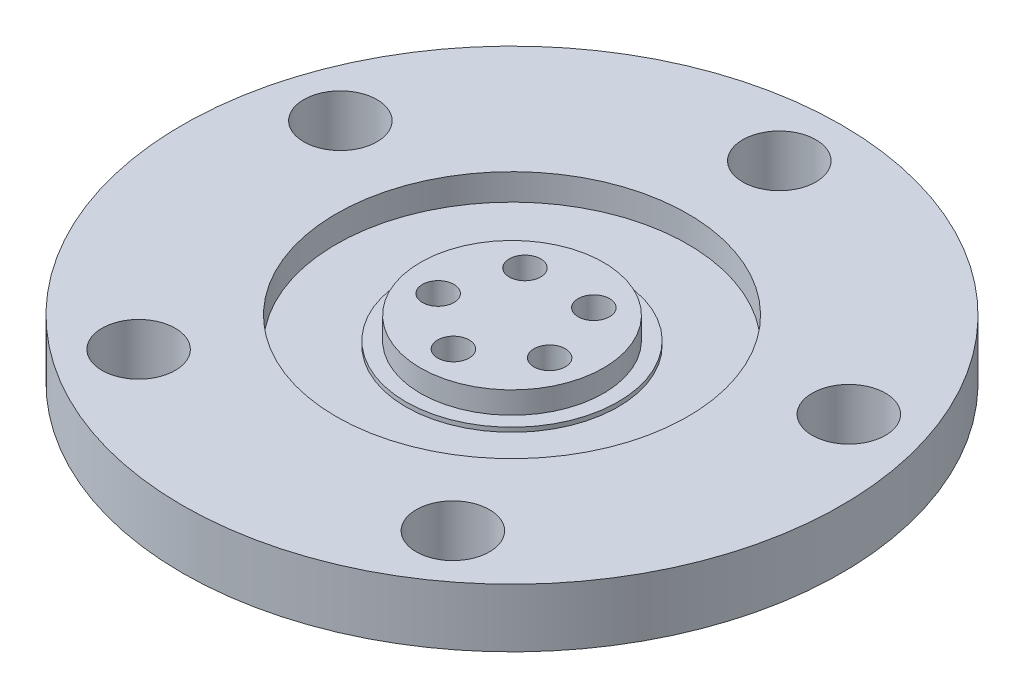
ISO-10303-21;
HEADER;
FILE_DESCRIPTION(('STEP AP214'),'2;1');
FILE_NAME('part.step','',(''),(''),'','','');
FILE_SCHEMA(('AUTOMOTIVE_DESIGN { 1 0 10303 214 1 1 1 1 }'));
ENDSEC;
DATA;
#1=APPLICATION_CONTEXT('core data for automotive mechanical design processes');
#2=APPLICATION_PROTOCOL_DEFINITION('international standard','automotive_design',2000,#1);
#3=PRODUCT_CONTEXT('',#1,'mechanical');
#4=PRODUCT('Part','Part','',(#3));
#5=PRODUCT_RELATED_PRODUCT_CATEGORY('part','',(#4));
#6=PRODUCT_DEFINITION_FORMATION('','',#4);
#7=PRODUCT_DEFINITION_CONTEXT('part definition',#1,'design');
#8=PRODUCT_DEFINITION('design','',#6,#7);
#9=PRODUCT_DEFINITION_SHAPE('','',#8);
#10=(LENGTH_UNIT() NAMED_UNIT(*) SI_UNIT(.MILLI.,.METRE.));
#11=(NAMED_UNIT(*) PLANE_ANGLE_UNIT() SI_UNIT($,.RADIAN.));
#12=(NAMED_UNIT(*) SI_UNIT($,.STERADIAN.) SOLID_ANGLE_UNIT());
#13=UNCERTAINTY_MEASURE_WITH_UNIT(LENGTH_MEASURE(1.E-05),#10,'distance_accuracy_value','');
#14=(GEOMETRIC_REPRESENTATION_CONTEXT(3) GLOBAL_UNCERTAINTY_ASSIGNED_CONTEXT((#13)) GLOBAL_UNIT_ASSIGNED_CONTEXT((#10,
#11,#12)) REPRESENTATION_CONTEXT('',''));
#15=CARTESIAN_POINT('',(0.,0.,0.));
#16=DIRECTION('',(0.,0.,1.));
#17=DIRECTION('',(1.,0.,0.));
#18=AXIS2_PLACEMENT_3D('',#15,#16,#17);
#19=CARTESIAN_POINT('',(0.,5.,0.));
#20=DIRECTION('',(0.,1.,0.));
#21=DIRECTION('',(0.,0.,1.));
#22=AXIS2_PLACEMENT_3D('',#19,#20,#21);
#23=PLANE('',#22);
#24=CARTESIAN_POINT('',(0.,5.,0.));
#25=DIRECTION('',(0.,1.,0.));
#26=DIRECTION('',(0.,0.,1.));
#27=AXIS2_PLACEMENT_3D('',#24,#25,#26);
#28=CIRCLE('',#27,12.5);
#29=CARTESIAN_POINT('',(0.,5.,12.5));
#30=VERTEX_POINT('',#29);
#31=EDGE_CURVE('E118',#30,#30,#28,.T.);
#32=ORIENTED_EDGE('',*,*,#31,.F.);
#33=EDGE_LOOP('',(#32));
#34=FACE_BOUND('',#33,.T.);
#35=CARTESIAN_POINT('',(0.,5.,0.));
#36=DIRECTION('',(0.,1.,0.));
#37=DIRECTION('',(0.,0.,1.));
#38=AXIS2_PLACEMENT_3D('',#35,#36,#37);
#39=CIRCLE('',#38,14.5);
#40=CARTESIAN_POINT('',(0.,5.,14.5));
#41=VERTEX_POINT('',#40);
#42=EDGE_CURVE('E128',#41,#41,#39,.T.);
#43=ORIENTED_EDGE('',*,*,#42,.T.);
#44=EDGE_LOOP('',(#43));
#45=FACE_BOUND('',#44,.T.);
#46=ADVANCED_FACE('F31',(#34,#45),#23,.T.);
#47=CARTESIAN_POINT('',(0.,8.,0.));
#48=DIRECTION('',(0.,1.,0.));
#49=DIRECTION('',(0.,0.,1.));
#50=AXIS2_PLACEMENT_3D('',#47,#48,#49);
#51=PLANE('',#50);
#52=CARTESIAN_POINT('',(-7.60845213036006,8.,2.47213595500001));
#53=DIRECTION('',(0.,1.,0.));
#54=DIRECTION('',(0.,0.,1.));
#55=AXIS2_PLACEMENT_3D('',#52,#53,#54);
#56=CIRCLE('',#55,2.15);
#57=CARTESIAN_POINT('',(-7.60845213036006,8.,4.62213595500001));
#58=VERTEX_POINT('',#57);
#59=EDGE_CURVE('E76',#58,#58,#56,.T.);
#60=ORIENTED_EDGE('',*,*,#59,.F.);
#61=EDGE_LOOP('',(#60));
#62=FACE_BOUND('',#61,.T.);
#63=CARTESIAN_POINT('',(1.92137482375957E-12,8.,7.9999999999994));
#64=DIRECTION('',(0.,1.,0.));
#65=DIRECTION('',(0.,0.,1.));
#66=AXIS2_PLACEMENT_3D('',#63,#64,#65);
#67=CIRCLE('',#66,2.15);
#68=CARTESIAN_POINT('',(1.92137482375957E-12,8.,10.1499999999994));
#69=VERTEX_POINT('',#68);
#70=EDGE_CURVE('E82',#69,#69,#67,.T.);
#71=ORIENTED_EDGE('',*,*,#70,.F.);
#72=EDGE_LOOP('',(#71));
#73=FACE_BOUND('',#72,.T.);
#74=CARTESIAN_POINT('',(7.60845213036239,8.,2.47213595499794));
#75=DIRECTION('',(0.,1.,0.));
#76=DIRECTION('',(0.,0.,1.));
#77=AXIS2_PLACEMENT_3D('',#74,#75,#76);
#78=CIRCLE('',#77,2.15);
#79=CARTESIAN_POINT('',(7.60845213036239,8.,4.62213595499793));
#80=VERTEX_POINT('',#79);
#81=EDGE_CURVE('E88',#80,#80,#78,.T.);
#82=ORIENTED_EDGE('',*,*,#81,.F.);
#83=EDGE_LOOP('',(#82));
#84=FACE_BOUND('',#83,.T.);
#85=CARTESIAN_POINT('',(4.70228201833973,8.,-6.47213595500082));
#86=DIRECTION('',(0.,1.,0.));
#87=DIRECTION('',(0.,0.,1.));
#88=AXIS2_PLACEMENT_3D('',#85,#86,#87);
#89=CIRCLE('',#88,2.15);
#90=CARTESIAN_POINT('',(4.70228201833973,8.,-4.32213595500083));
#91=VERTEX_POINT('',#90);
#92=EDGE_CURVE('E94',#91,#91,#89,.T.);
#93=ORIENTED_EDGE('',*,*,#92,.F.);
#94=EDGE_LOOP('',(#93));
#95=FACE_BOUND('',#94,.T.);
#96=CARTESIAN_POINT('',(-4.70228201833984,8.,-6.47213595499954));
#97=DIRECTION('',(0.,1.,0.));
#98=DIRECTION('',(0.,0.,1.));
#99=AXIS2_PLACEMENT_3D('',#96,#97,#98);
#100=CIRCLE('',#99,2.15);
#101=CARTESIAN_POINT('',(-4.70228201833984,8.,-4.32213595499954));
#102=VERTEX_POINT('',#101);
#103=EDGE_CURVE('E100',#102,#102,#100,.T.);
#104=ORIENTED_EDGE('',*,*,#103,.F.);
#105=EDGE_LOOP('',(#104));
#106=FACE_BOUND('',#105,.T.);
#107=CARTESIAN_POINT('',(0.,8.,0.));
#108=DIRECTION('',(0.,1.,0.));
#109=DIRECTION('',(0.,0.,1.));
#110=AXIS2_PLACEMENT_3D('',#107,#108,#109);
#111=CIRCLE('',#110,12.5);
#112=CARTESIAN_POINT('',(0.,8.,12.5));
#113=VERTEX_POINT('',#112);
#114=EDGE_CURVE('E119',#113,#113,#111,.T.);
#115=ORIENTED_EDGE('',*,*,#114,.T.);
#116=EDGE_LOOP('',(#115));
#117=FACE_BOUND('',#116,.T.);
#118=ADVANCED_FACE('F160',(#62,#73,#84,#95,#106,#117),#51,.T.);
#119=CARTESIAN_POINT('',(0.,0.,0.));
#120=DIRECTION('',(0.,1.,0.));
#121=DIRECTION('',(0.,0.,1.));
#122=AXIS2_PLACEMENT_3D('',#119,#120,#121);
#123=PLANE('',#122);
#124=CARTESIAN_POINT('',(-7.60845213036006,0.,2.47213595500001));
#125=DIRECTION('',(0.,1.,0.));
#126=DIRECTION('',(0.,0.,1.));
#127=AXIS2_PLACEMENT_3D('',#124,#125,#126);
#128=CIRCLE('',#127,2.15);
#129=CARTESIAN_POINT('',(-7.60845213036006,0.,4.62213595500001));
#130=VERTEX_POINT('',#129);
#131=EDGE_CURVE('E71',#130,#130,#128,.T.);
#132=ORIENTED_EDGE('',*,*,#131,.T.);
#133=EDGE_LOOP('',(#132));
#134=FACE_BOUND('',#133,.T.);
#135=CARTESIAN_POINT('',(1.92137482375957E-12,0.,7.9999999999994));
#136=DIRECTION('',(0.,1.,0.));
#137=DIRECTION('',(0.,0.,1.));
#138=AXIS2_PLACEMENT_3D('',#135,#136,#137);
#139=CIRCLE('',#138,2.15);
#140=CARTESIAN_POINT('',(1.92137482375957E-12,0.,10.1499999999994));
#141=VERTEX_POINT('',#140);
#142=EDGE_CURVE('E79',#141,#141,#139,.T.);
#143=ORIENTED_EDGE('',*,*,#142,.T.);
#144=EDGE_LOOP('',(#143));
#145=FACE_BOUND('',#144,.T.);
#146=CARTESIAN_POINT('',(7.60845213036239,0.,2.47213595499794));
#147=DIRECTION('',(0.,1.,0.));
#148=DIRECTION('',(0.,0.,1.));
#149=AXIS2_PLACEMENT_3D('',#146,#147,#148);
#150=CIRCLE('',#149,2.15);
#151=CARTESIAN_POINT('',(7.60845213036239,0.,4.62213595499793));
#152=VERTEX_POINT('',#151);
#153=EDGE_CURVE('E85',#152,#152,#150,.T.);
#154=ORIENTED_EDGE('',*,*,#153,.T.);
#155=EDGE_LOOP('',(#154));
#156=FACE_BOUND('',#155,.T.);
#157=CARTESIAN_POINT('',(4.70228201833973,0.,-6.47213595500082));
#158=DIRECTION('',(0.,1.,0.));
#159=DIRECTION('',(0.,0.,1.));
#160=AXIS2_PLACEMENT_3D('',#157,#158,#159);
#161=CIRCLE('',#160,2.15);
#162=CARTESIAN_POINT('',(4.70228201833973,0.,-4.32213595500083));
#163=VERTEX_POINT('',#162);
#164=EDGE_CURVE('E91',#163,#163,#161,.T.);
#165=ORIENTED_EDGE('',*,*,#164,.T.);
#166=EDGE_LOOP('',(#165));
#167=FACE_BOUND('',#166,.T.);
#168=CARTESIAN_POINT('',(-4.70228201833984,0.,-6.47213595499954));
#169=DIRECTION('',(0.,1.,0.));
#170=DIRECTION('',(0.,0.,1.));
#171=AXIS2_PLACEMENT_3D('',#168,#169,#170);
#172=CIRCLE('',#171,2.15);
#173=CARTESIAN_POINT('',(-4.70228201833984,0.,-4.32213595499954));
#174=VERTEX_POINT('',#173);
#175=EDGE_CURVE('E97',#174,#174,#172,.T.);
#176=ORIENTED_EDGE('',*,*,#175,.T.);
#177=EDGE_LOOP('',(#176));
#178=FACE_BOUND('',#177,.T.);
#179=CARTESIAN_POINT('',(0.,0.,0.));
#180=DIRECTION('',(0.,-1.,0.));
#181=DIRECTION('',(0.,0.,-1.));
#182=AXIS2_PLACEMENT_3D('',#179,#180,#181);
#183=CIRCLE('',#182,19.9);
#184=CARTESIAN_POINT('',(0.,0.,-19.9));
#185=VERTEX_POINT('',#184);
#186=EDGE_CURVE('E110',#185,#185,#183,.T.);
#187=ORIENTED_EDGE('',*,*,#186,.T.);
#188=EDGE_LOOP('',(#187));
#189=FACE_BOUND('',#188,.T.);
#190=ADVANCED_FACE('F165',(#134,#145,#156,#167,#178,#189),#123,.F.);
#191=CARTESIAN_POINT('',(0.,8.,0.));
#192=DIRECTION('',(0.,1.,0.));
#193=DIRECTION('',(0.,0.,1.));
#194=AXIS2_PLACEMENT_3D('',#191,#192,#193);
#195=CIRCLE('',#194,24.);
#196=CARTESIAN_POINT('',(0.,8.,24.));
#197=VERTEX_POINT('',#196);
#198=EDGE_CURVE('E113',#197,#197,#195,.T.);
#199=ORIENTED_EDGE('',*,*,#198,.F.);
#200=EDGE_LOOP('',(#199));
#201=FACE_BOUND('',#200,.T.);
#202=CARTESIAN_POINT('',(-21.4541617086725,8.,29.5291202946865));
#203=DIRECTION('',(0.,1.,0.));
#204=DIRECTION('',(0.,0.,1.));
#205=AXIS2_PLACEMENT_3D('',#202,#203,#204);
#206=CIRCLE('',#205,5.);
#207=CARTESIAN_POINT('',(-21.4541617086725,8.,34.5291202946865));
#208=VERTEX_POINT('',#207);
#209=EDGE_CURVE('E59',#208,#208,#206,.T.);
#210=ORIENTED_EDGE('',*,*,#209,.F.);
#211=EDGE_LOOP('',(#210));
#212=FACE_BOUND('',#211,.T.);
#213=CARTESIAN_POINT('',(34.7135628447742,8.,-11.2791202946871));
#214=DIRECTION('',(0.,1.,0.));
#215=DIRECTION('',(0.,0.,1.));
#216=AXIS2_PLACEMENT_3D('',#213,#214,#215);
#217=CIRCLE('',#216,5.);
#218=CARTESIAN_POINT('',(34.7135628447742,8.,-6.27912029468706));
#219=VERTEX_POINT('',#218);
#220=EDGE_CURVE('E47',#219,#219,#217,.T.);
#221=ORIENTED_EDGE('',*,*,#220,.F.);
#222=EDGE_LOOP('',(#221));
#223=FACE_BOUND('',#222,.T.);
#224=CARTESIAN_POINT('',(0.,8.,0.));
#225=DIRECTION('',(0.,1.,0.));
#226=DIRECTION('',(0.,0.,1.));
#227=AXIS2_PLACEMENT_3D('',#224,#225,#226);
#228=CIRCLE('',#227,45.);
#229=CARTESIAN_POINT('',(0.,8.,45.));
#230=VERTEX_POINT('',#229);
#231=EDGE_CURVE('E10',#230,#230,#228,.T.);
#232=ORIENTED_EDGE('',*,*,#231,.T.);
#233=EDGE_LOOP('',(#232));
#234=FACE_BOUND('',#233,.T.);
#235=CARTESIAN_POINT('',(0.,8.,-36.5));
#236=DIRECTION('',(0.,1.,0.));
#237=DIRECTION('',(0.,0.,1.));
#238=AXIS2_PLACEMENT_3D('',#235,#236,#237);
#239=CIRCLE('',#238,5.);
#240=CARTESIAN_POINT('',(0.,8.,-31.5));
#241=VERTEX_POINT('',#240);
#242=EDGE_CURVE('E42',#241,#241,#239,.T.);
#243=ORIENTED_EDGE('',*,*,#242,.F.);
#244=EDGE_LOOP('',(#243));
#245=FACE_BOUND('',#244,.T.);
#246=CARTESIAN_POINT('',(21.4541617086781,8.,29.5291202946847));
#247=DIRECTION('',(0.,1.,0.));
#248=DIRECTION('',(0.,0.,1.));
#249=AXIS2_PLACEMENT_3D('',#246,#247,#248);
#250=CIRCLE('',#249,5.);
#251=CARTESIAN_POINT('',(21.4541617086781,8.,34.5291202946847));
#252=VERTEX_POINT('',#251);
#253=EDGE_CURVE('E53',#252,#252,#250,.T.);
#254=ORIENTED_EDGE('',*,*,#253,.F.);
#255=EDGE_LOOP('',(#254));
#256=FACE_BOUND('',#255,.T.);
#257=CARTESIAN_POINT('',(-34.713562844772,8.,-11.2791202946841));
#258=DIRECTION('',(0.,1.,0.));
#259=DIRECTION('',(0.,0.,1.));
#260=AXIS2_PLACEMENT_3D('',#257,#258,#259);
#261=CIRCLE('',#260,5.);
#262=CARTESIAN_POINT('',(-34.713562844772,8.,-6.2791202946841));
#263=VERTEX_POINT('',#262);
#264=EDGE_CURVE('E65',#263,#263,#261,.T.);
#265=ORIENTED_EDGE('',*,*,#264,.F.);
#266=EDGE_LOOP('',(#265));
#267=FACE_BOUND('',#266,.T.);
#268=ADVANCED_FACE('F168',(#201,#212,#223,#234,#245,#256,#267),#51,.T.);
#269=CARTESIAN_POINT('',(0.,0.,0.));
#270=DIRECTION('',(0.,-1.,0.));
#271=DIRECTION('',(0.,0.,-1.));
#272=AXIS2_PLACEMENT_3D('',#269,#270,#271);
#273=CIRCLE('',#272,30.1);
#274=CARTESIAN_POINT('',(0.,0.,-30.1));
#275=VERTEX_POINT('',#274);
#276=EDGE_CURVE('E104',#275,#275,#273,.T.);
#277=ORIENTED_EDGE('',*,*,#276,.F.);
#278=EDGE_LOOP('',(#277));
#279=FACE_BOUND('',#278,.T.);
#280=CARTESIAN_POINT('',(0.,0.,0.));
#281=DIRECTION('',(0.,1.,0.));
#282=DIRECTION('',(0.,0.,1.));
#283=AXIS2_PLACEMENT_3D('',#280,#281,#282);
#284=CIRCLE('',#283,45.);
#285=CARTESIAN_POINT('',(0.,0.,45.));
#286=VERTEX_POINT('',#285);
#287=EDGE_CURVE('E35',#286,#286,#284,.T.);
#288=ORIENTED_EDGE('',*,*,#287,.F.);
#289=EDGE_LOOP('',(#288));
#290=FACE_BOUND('',#289,.T.);
#291=CARTESIAN_POINT('',(0.,0.,-36.5));
#292=DIRECTION('',(0.,1.,0.));
#293=DIRECTION('',(0.,0.,1.));
#294=AXIS2_PLACEMENT_3D('',#291,#292,#293);
#295=CIRCLE('',#294,5.);
#296=CARTESIAN_POINT('',(0.,0.,-31.5));
#297=VERTEX_POINT('',#296);
#298=EDGE_CURVE('E44',#297,#297,#295,.T.);
#299=ORIENTED_EDGE('',*,*,#298,.T.);
#300=EDGE_LOOP('',(#299));
#301=FACE_BOUND('',#300,.T.);
#302=CARTESIAN_POINT('',(34.7135628447742,0.,-11.2791202946871));
#303=DIRECTION('',(0.,1.,0.));
#304=DIRECTION('',(0.,0.,1.));
#305=AXIS2_PLACEMENT_3D('',#302,#303,#304);
#306=CIRCLE('',#305,5.);
#307=CARTESIAN_POINT('',(34.7135628447742,0.,-6.27912029468706));
#308=VERTEX_POINT('',#307);
#309=EDGE_CURVE('E50',#308,#308,#306,.T.);
#310=ORIENTED_EDGE('',*,*,#309,.T.);
#311=EDGE_LOOP('',(#310));
#312=FACE_BOUND('',#311,.T.);
#313=CARTESIAN_POINT('',(21.4541617086781,0.,29.5291202946847));
#314=DIRECTION('',(0.,1.,0.));
#315=DIRECTION('',(0.,0.,1.));
#316=AXIS2_PLACEMENT_3D('',#313,#314,#315);
#317=CIRCLE('',#316,5.);
#318=CARTESIAN_POINT('',(21.4541617086781,0.,34.5291202946847));
#319=VERTEX_POINT('',#318);
#320=EDGE_CURVE('E56',#319,#319,#317,.T.);
#321=ORIENTED_EDGE('',*,*,#320,.T.);
#322=EDGE_LOOP('',(#321));
#323=FACE_BOUND('',#322,.T.);
#324=CARTESIAN_POINT('',(-21.4541617086725,0.,29.5291202946865));
#325=DIRECTION('',(0.,1.,0.));
#326=DIRECTION('',(0.,0.,1.));
#327=AXIS2_PLACEMENT_3D('',#324,#325,#326);
#328=CIRCLE('',#327,5.);
#329=CARTESIAN_POINT('',(-21.4541617086725,0.,34.5291202946865));
#330=VERTEX_POINT('',#329);
#331=EDGE_CURVE('E62',#330,#330,#328,.T.);
#332=ORIENTED_EDGE('',*,*,#331,.T.);
#333=EDGE_LOOP('',(#332));
#334=FACE_BOUND('',#333,.T.);
#335=CARTESIAN_POINT('',(-34.713562844772,0.,-11.2791202946841));
#336=DIRECTION('',(0.,1.,0.));
#337=DIRECTION('',(0.,0.,1.));
#338=AXIS2_PLACEMENT_3D('',#335,#336,#337);
#339=CIRCLE('',#338,5.);
#340=CARTESIAN_POINT('',(-34.713562844772,0.,-6.2791202946841));
#341=VERTEX_POINT('',#340);
#342=EDGE_CURVE('E68',#341,#341,#339,.T.);
#343=ORIENTED_EDGE('',*,*,#342,.T.);
#344=EDGE_LOOP('',(#343));
#345=FACE_BOUND('',#344,.T.);
#346=ADVANCED_FACE('F242',(#279,#290,#301,#312,#323,#334,#345),#123,.F.);
#347=CARTESIAN_POINT('',(0.,8.,0.));
#348=DIRECTION('',(0.,-1.,0.));
#349=DIRECTION('',(0.,0.,-1.));
#350=AXIS2_PLACEMENT_3D('',#347,#348,#349);
#351=CYLINDRICAL_SURFACE('',#350,45.);
#352=ORIENTED_EDGE('',*,*,#231,.F.);
#353=EDGE_LOOP('',(#352));
#354=FACE_BOUND('',#353,.T.);
#355=ORIENTED_EDGE('',*,*,#287,.T.);
#356=EDGE_LOOP('',(#355));
#357=FACE_BOUND('',#356,.T.);
#358=ADVANCED_FACE('F33',(#354,#357),#351,.T.);
#359=CARTESIAN_POINT('',(0.,8.,-36.5));
#360=DIRECTION('',(0.,-1.,0.));
#361=DIRECTION('',(0.,0.,-1.));
#362=AXIS2_PLACEMENT_3D('',#359,#360,#361);
#363=CYLINDRICAL_SURFACE('',#362,5.);
#364=ORIENTED_EDGE('',*,*,#242,.T.);
#365=EDGE_LOOP('',(#364));
#366=FACE_BOUND('',#365,.T.);
#367=ORIENTED_EDGE('',*,*,#298,.F.);
#368=EDGE_LOOP('',(#367));
#369=FACE_BOUND('',#368,.T.);
#370=ADVANCED_FACE('F321',(#366,#369),#363,.F.);
#371=CARTESIAN_POINT('',(34.7135628447742,8.,-11.2791202946871));
#372=DIRECTION('',(0.,-1.,0.));
#373=DIRECTION('',(0.,0.,-1.));
#374=AXIS2_PLACEMENT_3D('',#371,#372,#373);
#375=CYLINDRICAL_SURFACE('',#374,5.);
#376=ORIENTED_EDGE('',*,*,#220,.T.);
#377=EDGE_LOOP('',(#376));
#378=FACE_BOUND('',#377,.T.);
#379=ORIENTED_EDGE('',*,*,#309,.F.);
#380=EDGE_LOOP('',(#379));
#381=FACE_BOUND('',#380,.T.);
#382=ADVANCED_FACE('F312',(#378,#381),#375,.F.);
#383=CARTESIAN_POINT('',(21.4541617086781,8.,29.5291202946847));
#384=DIRECTION('',(0.,-1.,0.));
#385=DIRECTION('',(0.,0.,-1.));
#386=AXIS2_PLACEMENT_3D('',#383,#384,#385);
#387=CYLINDRICAL_SURFACE('',#386,5.);
#388=ORIENTED_EDGE('',*,*,#253,.T.);
#389=EDGE_LOOP('',(#388));
#390=FACE_BOUND('',#389,.T.);
#391=ORIENTED_EDGE('',*,*,#320,.F.);
#392=EDGE_LOOP('',(#391));
#393=FACE_BOUND('',#392,.T.);
#394=ADVANCED_FACE('F303',(#390,#393),#387,.F.);
#395=CARTESIAN_POINT('',(-21.4541617086725,8.,29.5291202946865));
#396=DIRECTION('',(0.,-1.,0.));
#397=DIRECTION('',(0.,0.,-1.));
#398=AXIS2_PLACEMENT_3D('',#395,#396,#397);
#399=CYLINDRICAL_SURFACE('',#398,5.);
#400=ORIENTED_EDGE('',*,*,#209,.T.);
#401=EDGE_LOOP('',(#400));
#402=FACE_BOUND('',#401,.T.);
#403=ORIENTED_EDGE('',*,*,#331,.F.);
#404=EDGE_LOOP('',(#403));
#405=FACE_BOUND('',#404,.T.);
#406=ADVANCED_FACE('F294',(#402,#405),#399,.F.);
#407=CARTESIAN_POINT('',(-34.713562844772,8.,-11.2791202946841));
#408=DIRECTION('',(0.,-1.,0.));
#409=DIRECTION('',(0.,0.,-1.));
#410=AXIS2_PLACEMENT_3D('',#407,#408,#409);
#411=CYLINDRICAL_SURFACE('',#410,5.);
#412=ORIENTED_EDGE('',*,*,#264,.T.);
#413=EDGE_LOOP('',(#412));
#414=FACE_BOUND('',#413,.T.);
#415=ORIENTED_EDGE('',*,*,#342,.F.);
#416=EDGE_LOOP('',(#415));
#417=FACE_BOUND('',#416,.T.);
#418=ADVANCED_FACE('F285',(#414,#417),#411,.F.);
#419=CARTESIAN_POINT('',(-7.60845213036006,8.,2.47213595500001));
#420=DIRECTION('',(0.,1.,0.));
#421=DIRECTION('',(0.,0.,1.));
#422=AXIS2_PLACEMENT_3D('',#419,#420,#421);
#423=CYLINDRICAL_SURFACE('',#422,2.15);
#424=ORIENTED_EDGE('',*,*,#131,.F.);
#425=EDGE_LOOP('',(#424));
#426=FACE_BOUND('',#425,.T.);
#427=ORIENTED_EDGE('',*,*,#59,.T.);
#428=EDGE_LOOP('',(#427));
#429=FACE_BOUND('',#428,.T.);
#430=ADVANCED_FACE('F276',(#426,#429),#423,.F.);
#431=CARTESIAN_POINT('',(1.92137482375957E-12,8.,7.9999999999994));
#432=DIRECTION('',(0.,1.,0.));
#433=DIRECTION('',(0.,0.,1.));
#434=AXIS2_PLACEMENT_3D('',#431,#432,#433);
#435=CYLINDRICAL_SURFACE('',#434,2.15);
#436=ORIENTED_EDGE('',*,*,#142,.F.);
#437=EDGE_LOOP('',(#436));
#438=FACE_BOUND('',#437,.T.);
#439=ORIENTED_EDGE('',*,*,#70,.T.);
#440=EDGE_LOOP('',(#439));
#441=FACE_BOUND('',#440,.T.);
#442=ADVANCED_FACE('F267',(#438,#441),#435,.F.);
#443=CARTESIAN_POINT('',(7.60845213036239,8.,2.47213595499794));
#444=DIRECTION('',(0.,1.,0.));
#445=DIRECTION('',(0.,0.,1.));
#446=AXIS2_PLACEMENT_3D('',#443,#444,#445);
#447=CYLINDRICAL_SURFACE('',#446,2.15);
#448=ORIENTED_EDGE('',*,*,#153,.F.);
#449=EDGE_LOOP('',(#448));
#450=FACE_BOUND('',#449,.T.);
#451=ORIENTED_EDGE('',*,*,#81,.T.);
#452=EDGE_LOOP('',(#451));
#453=FACE_BOUND('',#452,.T.);
#454=ADVANCED_FACE('F258',(#450,#453),#447,.F.);
#455=CARTESIAN_POINT('',(4.70228201833973,8.,-6.47213595500082));
#456=DIRECTION('',(0.,1.,0.));
#457=DIRECTION('',(0.,0.,1.));
#458=AXIS2_PLACEMENT_3D('',#455,#456,#457);
#459=CYLINDRICAL_SURFACE('',#458,2.15);
#460=ORIENTED_EDGE('',*,*,#164,.F.);
#461=EDGE_LOOP('',(#460));
#462=FACE_BOUND('',#461,.T.);
#463=ORIENTED_EDGE('',*,*,#92,.T.);
#464=EDGE_LOOP('',(#463));
#465=FACE_BOUND('',#464,.T.);
#466=ADVANCED_FACE('F249',(#462,#465),#459,.F.);
#467=CARTESIAN_POINT('',(-4.70228201833984,8.,-6.47213595499954));
#468=DIRECTION('',(0.,1.,0.));
#469=DIRECTION('',(0.,0.,1.));
#470=AXIS2_PLACEMENT_3D('',#467,#468,#469);
#471=CYLINDRICAL_SURFACE('',#470,2.15);
#472=ORIENTED_EDGE('',*,*,#175,.F.);
#473=EDGE_LOOP('',(#472));
#474=FACE_BOUND('',#473,.T.);
#475=ORIENTED_EDGE('',*,*,#103,.T.);
#476=EDGE_LOOP('',(#475));
#477=FACE_BOUND('',#476,.T.);
#478=ADVANCED_FACE('F231',(#474,#477),#471,.F.);
#479=CARTESIAN_POINT('',(0.,1.5,0.));
#480=DIRECTION('',(0.,-1.,0.));
#481=DIRECTION('',(0.,0.,-1.));
#482=AXIS2_PLACEMENT_3D('',#479,#480,#481);
#483=CYLINDRICAL_SURFACE('',#482,30.1);
#484=CARTESIAN_POINT('',(0.,1.5,0.));
#485=DIRECTION('',(0.,-1.,0.));
#486=DIRECTION('',(0.,0.,-1.));
#487=AXIS2_PLACEMENT_3D('',#484,#485,#486);
#488=CIRCLE('',#487,30.1);
#489=CARTESIAN_POINT('',(0.,1.5,-30.1));
#490=VERTEX_POINT('',#489);
#491=EDGE_CURVE('E103',#490,#490,#488,.T.);
#492=ORIENTED_EDGE('',*,*,#491,.F.);
#493=EDGE_LOOP('',(#492));
#494=FACE_BOUND('',#493,.T.);
#495=ORIENTED_EDGE('',*,*,#276,.T.);
#496=EDGE_LOOP('',(#495));
#497=FACE_BOUND('',#496,.T.);
#498=ADVANCED_FACE('F222',(#494,#497),#483,.F.);
#499=CARTESIAN_POINT('',(0.,1.5,0.));
#500=DIRECTION('',(0.,-1.,0.));
#501=DIRECTION('',(0.,0.,-1.));
#502=AXIS2_PLACEMENT_3D('',#499,#500,#501);
#503=PLANE('',#502);
#504=CARTESIAN_POINT('',(0.,1.5,0.));
#505=DIRECTION('',(0.,-1.,0.));
#506=DIRECTION('',(0.,0.,-1.));
#507=AXIS2_PLACEMENT_3D('',#504,#505,#506);
#508=CIRCLE('',#507,19.9);
#509=CARTESIAN_POINT('',(0.,1.5,-19.9));
#510=VERTEX_POINT('',#509);
#511=EDGE_CURVE('E107',#510,#510,#508,.T.);
#512=ORIENTED_EDGE('',*,*,#511,.F.);
#513=EDGE_LOOP('',(#512));
#514=FACE_BOUND('',#513,.T.);
#515=ORIENTED_EDGE('',*,*,#491,.T.);
#516=EDGE_LOOP('',(#515));
#517=FACE_BOUND('',#516,.T.);
#518=ADVANCED_FACE('F155',(#514,#517),#503,.T.);
#519=CARTESIAN_POINT('',(0.,1.5,0.));
#520=DIRECTION('',(0.,-1.,0.));
#521=DIRECTION('',(0.,0.,-1.));
#522=AXIS2_PLACEMENT_3D('',#519,#520,#521);
#523=CYLINDRICAL_SURFACE('',#522,19.9);
#524=ORIENTED_EDGE('',*,*,#511,.T.);
#525=EDGE_LOOP('',(#524));
#526=FACE_BOUND('',#525,.T.);
#527=ORIENTED_EDGE('',*,*,#186,.F.);
#528=EDGE_LOOP('',(#527));
#529=FACE_BOUND('',#528,.T.);
#530=ADVANCED_FACE('F146',(#526,#529),#523,.T.);
#531=CARTESIAN_POINT('',(0.,5.,0.));
#532=DIRECTION('',(0.,1.,0.));
#533=DIRECTION('',(0.,0.,1.));
#534=AXIS2_PLACEMENT_3D('',#531,#532,#533);
#535=CYLINDRICAL_SURFACE('',#534,24.);
#536=ORIENTED_EDGE('',*,*,#198,.T.);
#537=EDGE_LOOP('',(#536));
#538=FACE_BOUND('',#537,.T.);
#539=CARTESIAN_POINT('',(0.,4.4,0.));
#540=DIRECTION('',(0.,1.,0.));
#541=DIRECTION('',(0.,0.,1.));
#542=AXIS2_PLACEMENT_3D('',#539,#540,#541);
#543=CIRCLE('',#542,24.);
#544=CARTESIAN_POINT('',(0.,4.4,24.));
#545=VERTEX_POINT('',#544);
#546=EDGE_CURVE('E122',#545,#545,#543,.T.);
#547=ORIENTED_EDGE('',*,*,#546,.F.);
#548=EDGE_LOOP('',(#547));
#549=FACE_BOUND('',#548,.T.);
#550=ADVANCED_FACE('F144',(#538,#549),#535,.F.);
#551=CARTESIAN_POINT('',(0.,5.,0.));
#552=DIRECTION('',(0.,1.,0.));
#553=DIRECTION('',(0.,0.,1.));
#554=AXIS2_PLACEMENT_3D('',#551,#552,#553);
#555=CYLINDRICAL_SURFACE('',#554,12.5);
#556=ORIENTED_EDGE('',*,*,#31,.T.);
#557=EDGE_LOOP('',(#556));
#558=FACE_BOUND('',#557,.T.);
#559=ORIENTED_EDGE('',*,*,#114,.F.);
#560=EDGE_LOOP('',(#559));
#561=FACE_BOUND('',#560,.T.);
#562=ADVANCED_FACE('F140',(#558,#561),#555,.T.);
#563=CARTESIAN_POINT('',(0.,4.4,0.));
#564=DIRECTION('',(0.,1.,0.));
#565=DIRECTION('',(0.,0.,1.));
#566=AXIS2_PLACEMENT_3D('',#563,#564,#565);
#567=PLANE('',#566);
#568=CARTESIAN_POINT('',(0.,4.4,0.));
#569=DIRECTION('',(0.,1.,0.));
#570=DIRECTION('',(0.,0.,1.));
#571=AXIS2_PLACEMENT_3D('',#568,#569,#570);
#572=CIRCLE('',#571,14.5);
#573=CARTESIAN_POINT('',(0.,4.4,14.5));
#574=VERTEX_POINT('',#573);
#575=EDGE_CURVE('E127',#574,#574,#572,.T.);
#576=ORIENTED_EDGE('',*,*,#575,.F.);
#577=EDGE_LOOP('',(#576));
#578=FACE_BOUND('',#577,.T.);
#579=ORIENTED_EDGE('',*,*,#546,.T.);
#580=EDGE_LOOP('',(#579));
#581=FACE_BOUND('',#580,.T.);
#582=ADVANCED_FACE('F137',(#578,#581),#567,.T.);
#583=CARTESIAN_POINT('',(0.,4.4,0.));
#584=DIRECTION('',(0.,1.,0.));
#585=DIRECTION('',(0.,0.,1.));
#586=AXIS2_PLACEMENT_3D('',#583,#584,#585);
#587=CYLINDRICAL_SURFACE('',#586,14.5);
#588=ORIENTED_EDGE('',*,*,#575,.T.);
#589=EDGE_LOOP('',(#588));
#590=FACE_BOUND('',#589,.T.);
#591=ORIENTED_EDGE('',*,*,#42,.F.);
#592=EDGE_LOOP('',(#591));
#593=FACE_BOUND('',#592,.T.);
#594=ADVANCED_FACE('F134',(#590,#593),#587,.T.);
#595=CLOSED_SHELL('',(#46,#118,#190,#268,#346,#358,#370,#382,#394,#406,#418,#430,#442,#454,#466,
#478,#498,#518,#530,#550,#562,#582,#594));
#596=MANIFOLD_SOLID_BREP('B2',#595);
#597=ADVANCED_BREP_SHAPE_REPRESENTATION('',(#18,#596),#14);
#598=SHAPE_DEFINITION_REPRESENTATION(#9,#597);
ENDSEC;
END-ISO-10303-21;
